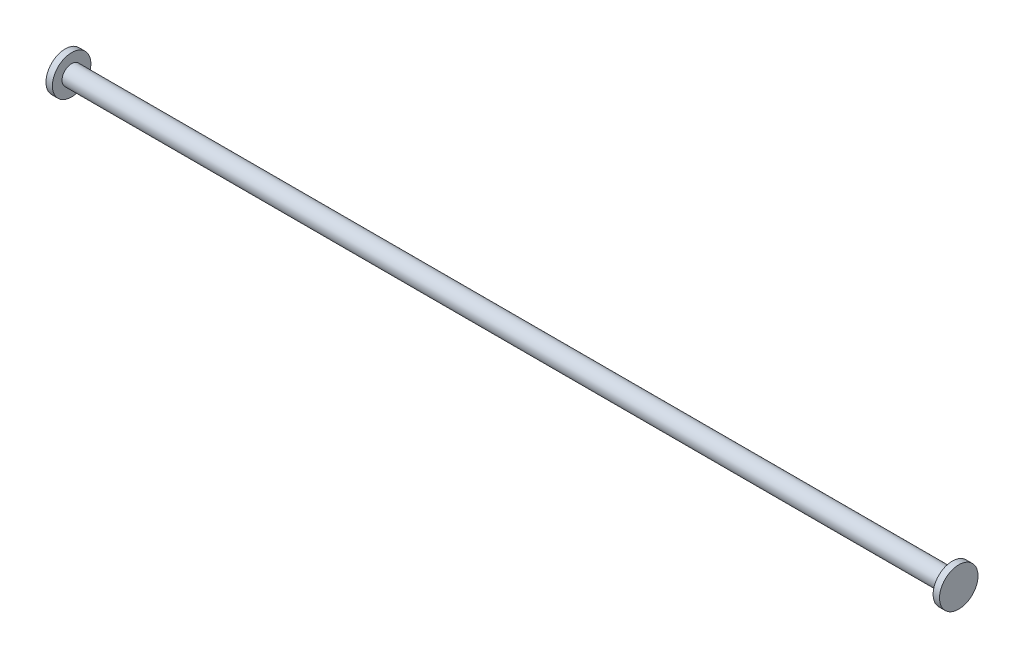
ISO-10303-21;
HEADER;
FILE_DESCRIPTION(('STEP AP214'),'2;1');
FILE_NAME('part.step','',(''),(''),'','','');
FILE_SCHEMA(('AUTOMOTIVE_DESIGN { 1 0 10303 214 1 1 1 1 }'));
ENDSEC;
DATA;
#1=APPLICATION_CONTEXT('core data for automotive mechanical design processes');
#2=APPLICATION_PROTOCOL_DEFINITION('international standard','automotive_design',2000,#1);
#3=PRODUCT_CONTEXT('',#1,'mechanical');
#4=PRODUCT('Part','Part','',(#3));
#5=PRODUCT_RELATED_PRODUCT_CATEGORY('part','',(#4));
#6=PRODUCT_DEFINITION_FORMATION('','',#4);
#7=PRODUCT_DEFINITION_CONTEXT('part definition',#1,'design');
#8=PRODUCT_DEFINITION('design','',#6,#7);
#9=PRODUCT_DEFINITION_SHAPE('','',#8);
#10=(LENGTH_UNIT() NAMED_UNIT(*) SI_UNIT(.MILLI.,.METRE.));
#11=(NAMED_UNIT(*) PLANE_ANGLE_UNIT() SI_UNIT($,.RADIAN.));
#12=(NAMED_UNIT(*) SI_UNIT($,.STERADIAN.) SOLID_ANGLE_UNIT());
#13=UNCERTAINTY_MEASURE_WITH_UNIT(LENGTH_MEASURE(1.E-05),#10,'distance_accuracy_value','');
#14=(GEOMETRIC_REPRESENTATION_CONTEXT(3) GLOBAL_UNCERTAINTY_ASSIGNED_CONTEXT((#13)) GLOBAL_UNIT_ASSIGNED_CONTEXT((#10,
#11,#12)) REPRESENTATION_CONTEXT('',''));
#15=CARTESIAN_POINT('',(0.,0.,0.));
#16=DIRECTION('',(0.,0.,1.));
#17=DIRECTION('',(1.,0.,0.));
#18=AXIS2_PLACEMENT_3D('',#15,#16,#17);
#19=CARTESIAN_POINT('',(1743.6465,0.,0.));
#20=DIRECTION('',(-1.,0.,0.));
#21=DIRECTION('',(0.,0.,1.));
#22=AXIS2_PLACEMENT_3D('',#19,#20,#21);
#23=CYLINDRICAL_SURFACE('',#22,38.1);
#24=CARTESIAN_POINT('',(1743.6465,0.,0.));
#25=DIRECTION('',(1.,0.,0.));
#26=DIRECTION('',(0.,0.,-1.));
#27=AXIS2_PLACEMENT_3D('',#24,#25,#26);
#28=CIRCLE('',#27,38.1);
#29=CARTESIAN_POINT('',(1743.6465,0.,-38.1));
#30=VERTEX_POINT('',#29);
#31=EDGE_CURVE('E10',#30,#30,#28,.T.);
#32=ORIENTED_EDGE('',*,*,#31,.F.);
#33=EDGE_LOOP('',(#32));
#34=FACE_BOUND('',#33,.T.);
#35=CARTESIAN_POINT('',(-1743.6465,0.,0.));
#36=DIRECTION('',(1.,0.,0.));
#37=DIRECTION('',(0.,0.,-1.));
#38=AXIS2_PLACEMENT_3D('',#35,#36,#37);
#39=CIRCLE('',#38,38.1);
#40=CARTESIAN_POINT('',(-1743.6465,0.,-38.1));
#41=VERTEX_POINT('',#40);
#42=EDGE_CURVE('E46',#41,#41,#39,.T.);
#43=ORIENTED_EDGE('',*,*,#42,.T.);
#44=EDGE_LOOP('',(#43));
#45=FACE_BOUND('',#44,.T.);
#46=ADVANCED_FACE('F43',(#34,#45),#23,.T.);
#47=CARTESIAN_POINT('',(1769.0465,0.,0.));
#48=DIRECTION('',(-1.,0.,0.));
#49=DIRECTION('',(0.,0.,1.));
#50=AXIS2_PLACEMENT_3D('',#47,#48,#49);
#51=CYLINDRICAL_SURFACE('',#50,76.2);
#52=CARTESIAN_POINT('',(1769.0465,0.,0.));
#53=DIRECTION('',(1.,0.,0.));
#54=DIRECTION('',(0.,0.,-1.));
#55=AXIS2_PLACEMENT_3D('',#52,#53,#54);
#56=CIRCLE('',#55,76.2);
#57=CARTESIAN_POINT('',(1769.0465,0.,-76.2));
#58=VERTEX_POINT('',#57);
#59=EDGE_CURVE('E51',#58,#58,#56,.T.);
#60=ORIENTED_EDGE('',*,*,#59,.F.);
#61=EDGE_LOOP('',(#60));
#62=FACE_BOUND('',#61,.T.);
#63=CARTESIAN_POINT('',(1743.6465,0.,0.));
#64=DIRECTION('',(1.,0.,0.));
#65=DIRECTION('',(0.,0.,-1.));
#66=AXIS2_PLACEMENT_3D('',#63,#64,#65);
#67=CIRCLE('',#66,76.2);
#68=CARTESIAN_POINT('',(1743.6465,0.,-76.2));
#69=VERTEX_POINT('',#68);
#70=EDGE_CURVE('E56',#69,#69,#67,.T.);
#71=ORIENTED_EDGE('',*,*,#70,.T.);
#72=EDGE_LOOP('',(#71));
#73=FACE_BOUND('',#72,.T.);
#74=ADVANCED_FACE('F97',(#62,#73),#51,.T.);
#75=CARTESIAN_POINT('',(1769.0465,0.,0.));
#76=DIRECTION('',(1.,0.,0.));
#77=DIRECTION('',(0.,0.,-1.));
#78=AXIS2_PLACEMENT_3D('',#75,#76,#77);
#79=PLANE('',#78);
#80=ORIENTED_EDGE('',*,*,#59,.T.);
#81=EDGE_LOOP('',(#80));
#82=FACE_BOUND('',#81,.T.);
#83=ADVANCED_FACE('F93',(#82),#79,.T.);
#84=CARTESIAN_POINT('',(1743.6465,0.,0.));
#85=DIRECTION('',(1.,0.,0.));
#86=DIRECTION('',(0.,0.,-1.));
#87=AXIS2_PLACEMENT_3D('',#84,#85,#86);
#88=PLANE('',#87);
#89=ORIENTED_EDGE('',*,*,#31,.T.);
#90=EDGE_LOOP('',(#89));
#91=FACE_BOUND('',#90,.T.);
#92=ORIENTED_EDGE('',*,*,#70,.F.);
#93=EDGE_LOOP('',(#92));
#94=FACE_BOUND('',#93,.T.);
#95=ADVANCED_FACE('F85',(#91,#94),#88,.F.);
#96=CARTESIAN_POINT('',(-1769.0465,0.,0.));
#97=DIRECTION('',(1.,0.,0.));
#98=DIRECTION('',(0.,0.,-1.));
#99=AXIS2_PLACEMENT_3D('',#96,#97,#98);
#100=CYLINDRICAL_SURFACE('',#99,76.2);
#101=CARTESIAN_POINT('',(-1769.0465,0.,0.));
#102=DIRECTION('',(1.,0.,0.));
#103=DIRECTION('',(0.,0.,-1.));
#104=AXIS2_PLACEMENT_3D('',#101,#102,#103);
#105=CIRCLE('',#104,76.2);
#106=CARTESIAN_POINT('',(-1769.0465,0.,-76.2));
#107=VERTEX_POINT('',#106);
#108=EDGE_CURVE('E66',#107,#107,#105,.T.);
#109=ORIENTED_EDGE('',*,*,#108,.T.);
#110=EDGE_LOOP('',(#109));
#111=FACE_BOUND('',#110,.T.);
#112=CARTESIAN_POINT('',(-1743.6465,0.,0.));
#113=DIRECTION('',(1.,0.,0.));
#114=DIRECTION('',(0.,0.,-1.));
#115=AXIS2_PLACEMENT_3D('',#112,#113,#114);
#116=CIRCLE('',#115,76.2);
#117=CARTESIAN_POINT('',(-1743.6465,0.,-76.2));
#118=VERTEX_POINT('',#117);
#119=EDGE_CURVE('E62',#118,#118,#116,.T.);
#120=ORIENTED_EDGE('',*,*,#119,.F.);
#121=EDGE_LOOP('',(#120));
#122=FACE_BOUND('',#121,.T.);
#123=ADVANCED_FACE('F83',(#111,#122),#100,.T.);
#124=CARTESIAN_POINT('',(-1769.0465,0.,0.));
#125=DIRECTION('',(-1.,0.,0.));
#126=DIRECTION('',(0.,0.,-1.));
#127=AXIS2_PLACEMENT_3D('',#124,#125,#126);
#128=PLANE('',#127);
#129=ORIENTED_EDGE('',*,*,#108,.F.);
#130=EDGE_LOOP('',(#129));
#131=FACE_BOUND('',#130,.T.);
#132=ADVANCED_FACE('F79',(#131),#128,.T.);
#133=CARTESIAN_POINT('',(-1743.6465,0.,0.));
#134=DIRECTION('',(-1.,0.,0.));
#135=DIRECTION('',(0.,0.,-1.));
#136=AXIS2_PLACEMENT_3D('',#133,#134,#135);
#137=PLANE('',#136);
#138=ORIENTED_EDGE('',*,*,#42,.F.);
#139=EDGE_LOOP('',(#138));
#140=FACE_BOUND('',#139,.T.);
#141=ORIENTED_EDGE('',*,*,#119,.T.);
#142=EDGE_LOOP('',(#141));
#143=FACE_BOUND('',#142,.T.);
#144=ADVANCED_FACE('F76',(#140,#143),#137,.F.);
#145=CLOSED_SHELL('',(#46,#74,#83,#95,#123,#132,#144));
#146=MANIFOLD_SOLID_BREP('B2',#145);
#147=ADVANCED_BREP_SHAPE_REPRESENTATION('',(#18,#146),#14);
#148=SHAPE_DEFINITION_REPRESENTATION(#9,#147);
ENDSEC;
END-ISO-10303-21;
